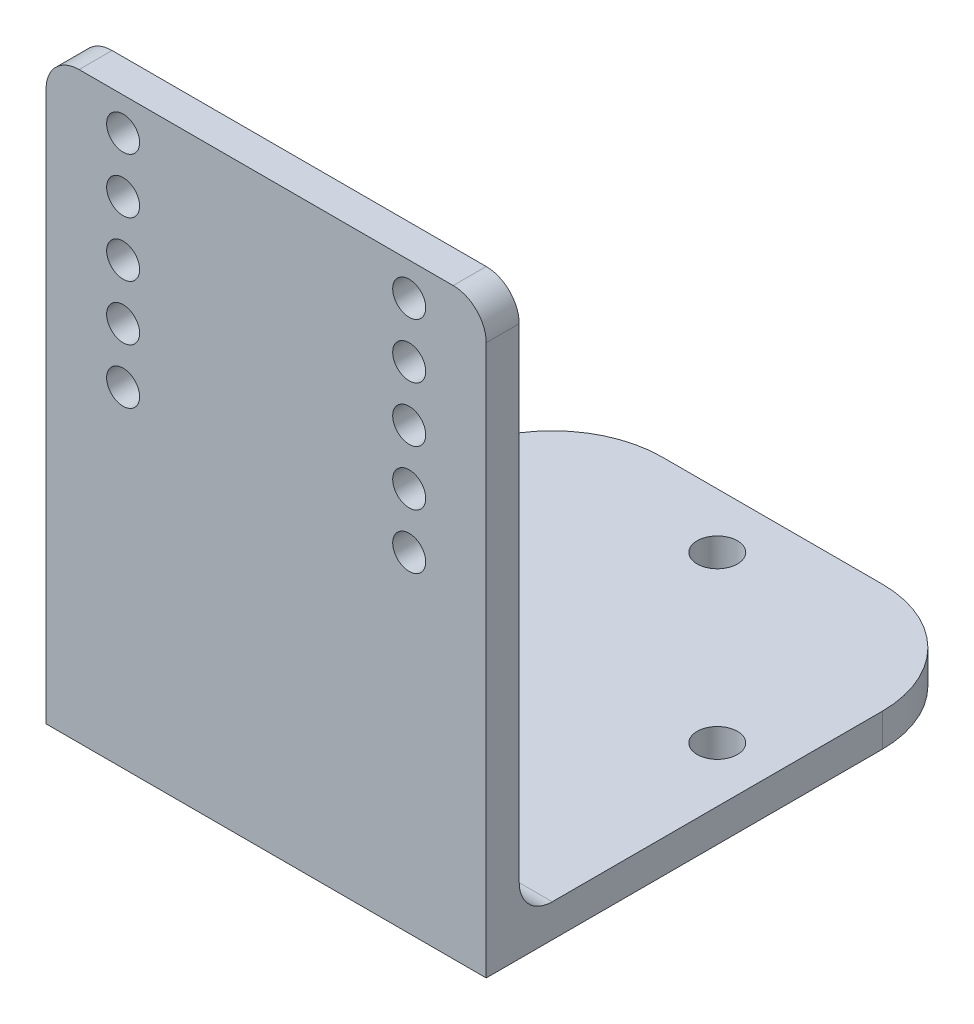
ISO-10303-21;
HEADER;
FILE_DESCRIPTION(('STEP AP214'),'2;1');
FILE_NAME('part.step','',(''),(''),'','','');
FILE_SCHEMA(('AUTOMOTIVE_DESIGN { 1 0 10303 214 1 1 1 1 }'));
ENDSEC;
DATA;
#1=APPLICATION_CONTEXT('core data for automotive mechanical design processes');
#2=APPLICATION_PROTOCOL_DEFINITION('international standard','automotive_design',2000,#1);
#3=PRODUCT_CONTEXT('',#1,'mechanical');
#4=PRODUCT('Part','Part','',(#3));
#5=PRODUCT_RELATED_PRODUCT_CATEGORY('part','',(#4));
#6=PRODUCT_DEFINITION_FORMATION('','',#4);
#7=PRODUCT_DEFINITION_CONTEXT('part definition',#1,'design');
#8=PRODUCT_DEFINITION('design','',#6,#7);
#9=PRODUCT_DEFINITION_SHAPE('','',#8);
#10=(LENGTH_UNIT() NAMED_UNIT(*) SI_UNIT(.MILLI.,.METRE.));
#11=(NAMED_UNIT(*) PLANE_ANGLE_UNIT() SI_UNIT($,.RADIAN.));
#12=(NAMED_UNIT(*) SI_UNIT($,.STERADIAN.) SOLID_ANGLE_UNIT());
#13=UNCERTAINTY_MEASURE_WITH_UNIT(LENGTH_MEASURE(1.E-05),#10,'distance_accuracy_value','');
#14=(GEOMETRIC_REPRESENTATION_CONTEXT(3) GLOBAL_UNCERTAINTY_ASSIGNED_CONTEXT((#13)) GLOBAL_UNIT_ASSIGNED_CONTEXT((#10,
#11,#12)) REPRESENTATION_CONTEXT('',''));
#15=CARTESIAN_POINT('',(0.,0.,0.));
#16=DIRECTION('',(0.,0.,1.));
#17=DIRECTION('',(1.,0.,0.));
#18=AXIS2_PLACEMENT_3D('',#15,#16,#17);
#19=CARTESIAN_POINT('',(0.,3.,0.));
#20=DIRECTION('',(0.,-1.,0.));
#21=DIRECTION('',(0.,0.,-1.));
#22=AXIS2_PLACEMENT_3D('',#19,#20,#21);
#23=PLANE('',#22);
#24=DIRECTION('',(-1.,0.,0.));
#25=VECTOR('',#24,1.);
#26=CARTESIAN_POINT('',(-20.,3.,-20.));
#27=LINE('',#26,#25);
#28=CARTESIAN_POINT('',(9.99999999999999,3.,-20.));
#29=VERTEX_POINT('',#28);
#30=CARTESIAN_POINT('',(-10.,3.,-20.));
#31=VERTEX_POINT('',#30);
#32=EDGE_CURVE('E262',#29,#31,#27,.T.);
#33=ORIENTED_EDGE('',*,*,#32,.T.);
#34=CARTESIAN_POINT('',(-10.,3.,-9.99999999999999));
#35=DIRECTION('',(0.,-1.,0.));
#36=DIRECTION('',(0.,0.,-1.));
#37=AXIS2_PLACEMENT_3D('',#34,#35,#36);
#38=CIRCLE('',#37,10.);
#39=CARTESIAN_POINT('',(-20.,3.,-9.99999999999999));
#40=VERTEX_POINT('',#39);
#41=EDGE_CURVE('E54',#31,#40,#38,.F.);
#42=ORIENTED_EDGE('',*,*,#41,.T.);
#43=DIRECTION('',(0.,0.,1.));
#44=VECTOR('',#43,1.);
#45=CARTESIAN_POINT('',(-20.,3.,23.));
#46=LINE('',#45,#44);
#47=CARTESIAN_POINT('',(-20.,3.,20.));
#48=VERTEX_POINT('',#47);
#49=EDGE_CURVE('E255',#40,#48,#46,.T.);
#50=ORIENTED_EDGE('',*,*,#49,.T.);
#51=DIRECTION('',(1.,0.,0.));
#52=VECTOR('',#51,1.);
#53=CARTESIAN_POINT('',(0.,3.,20.));
#54=LINE('',#53,#52);
#55=CARTESIAN_POINT('',(-10.,3.,20.));
#56=VERTEX_POINT('',#55);
#57=EDGE_CURVE('E321',#48,#56,#54,.T.);
#58=ORIENTED_EDGE('',*,*,#57,.T.);
#59=DIRECTION('',(0.,0.,1.));
#60=VECTOR('',#59,1.);
#61=CARTESIAN_POINT('',(-10.,3.,23.));
#62=LINE('',#61,#60);
#63=CARTESIAN_POINT('',(-10.,3.,16.));
#64=VERTEX_POINT('',#63);
#65=EDGE_CURVE('E378',#64,#56,#62,.T.);
#66=ORIENTED_EDGE('',*,*,#65,.F.);
#67=CARTESIAN_POINT('',(-7.,3.,16.));
#68=DIRECTION('',(0.,-1.,0.));
#69=DIRECTION('',(0.,0.,-1.));
#70=AXIS2_PLACEMENT_3D('',#67,#68,#69);
#71=CIRCLE('',#70,3.);
#72=CARTESIAN_POINT('',(-7.,3.,13.));
#73=VERTEX_POINT('',#72);
#74=EDGE_CURVE('E362',#64,#73,#71,.T.);
#75=ORIENTED_EDGE('',*,*,#74,.T.);
#76=DIRECTION('',(-1.,0.,0.));
#77=VECTOR('',#76,1.);
#78=CARTESIAN_POINT('',(-10.,3.,13.));
#79=LINE('',#78,#77);
#80=CARTESIAN_POINT('',(7.,3.,13.));
#81=VERTEX_POINT('',#80);
#82=EDGE_CURVE('E444',#81,#73,#79,.T.);
#83=ORIENTED_EDGE('',*,*,#82,.F.);
#84=CARTESIAN_POINT('',(7.,3.,16.));
#85=DIRECTION('',(0.,-1.,0.));
#86=DIRECTION('',(0.,0.,-1.));
#87=AXIS2_PLACEMENT_3D('',#84,#85,#86);
#88=CIRCLE('',#87,3.);
#89=CARTESIAN_POINT('',(10.,3.,16.));
#90=VERTEX_POINT('',#89);
#91=EDGE_CURVE('E368',#81,#90,#88,.T.);
#92=ORIENTED_EDGE('',*,*,#91,.T.);
#93=DIRECTION('',(0.,0.,-1.));
#94=VECTOR('',#93,1.);
#95=CARTESIAN_POINT('',(10.,3.,23.));
#96=LINE('',#95,#94);
#97=CARTESIAN_POINT('',(10.,3.,20.));
#98=VERTEX_POINT('',#97);
#99=EDGE_CURVE('E440',#98,#90,#96,.T.);
#100=ORIENTED_EDGE('',*,*,#99,.F.);
#101=DIRECTION('',(1.,0.,0.));
#102=VECTOR('',#101,1.);
#103=CARTESIAN_POINT('',(0.,3.,20.));
#104=LINE('',#103,#102);
#105=CARTESIAN_POINT('',(20.,3.,20.));
#106=VERTEX_POINT('',#105);
#107=EDGE_CURVE('E325',#98,#106,#104,.T.);
#108=ORIENTED_EDGE('',*,*,#107,.T.);
#109=DIRECTION('',(0.,0.,-1.));
#110=VECTOR('',#109,1.);
#111=CARTESIAN_POINT('',(20.,3.,23.));
#112=LINE('',#111,#110);
#113=CARTESIAN_POINT('',(20.,3.,-9.99999999999999));
#114=VERTEX_POINT('',#113);
#115=EDGE_CURVE('E258',#106,#114,#112,.T.);
#116=ORIENTED_EDGE('',*,*,#115,.T.);
#117=CARTESIAN_POINT('',(9.99999999999999,3.,-10.));
#118=DIRECTION('',(0.,-1.,0.));
#119=DIRECTION('',(0.,0.,-1.));
#120=AXIS2_PLACEMENT_3D('',#117,#118,#119);
#121=CIRCLE('',#120,10.);
#122=EDGE_CURVE('E396',#114,#29,#121,.F.);
#123=ORIENTED_EDGE('',*,*,#122,.T.);
#124=EDGE_LOOP('',(#33,#42,#50,#58,#66,#75,#83,#92,#100,#108,#116,#123));
#125=FACE_BOUND('',#124,.T.);
#126=CARTESIAN_POINT('',(0.,3.,-15.));
#127=DIRECTION('',(0.,1.,0.));
#128=DIRECTION('',(0.,0.,1.));
#129=AXIS2_PLACEMENT_3D('',#126,#127,#128);
#130=CIRCLE('',#129,1.83079673218972);
#131=CARTESIAN_POINT('',(0.,3.,-13.1692032678103));
#132=VERTEX_POINT('',#131);
#133=EDGE_CURVE('E193',#132,#132,#130,.T.);
#134=ORIENTED_EDGE('',*,*,#133,.F.);
#135=EDGE_LOOP('',(#134));
#136=FACE_BOUND('',#135,.T.);
#137=CARTESIAN_POINT('',(-15.,3.,0.));
#138=DIRECTION('',(0.,1.,0.));
#139=DIRECTION('',(0.,0.,1.));
#140=AXIS2_PLACEMENT_3D('',#137,#138,#139);
#141=CIRCLE('',#140,1.83079673218972);
#142=CARTESIAN_POINT('',(-15.,3.,1.83079673218972));
#143=VERTEX_POINT('',#142);
#144=EDGE_CURVE('E241',#143,#143,#141,.T.);
#145=ORIENTED_EDGE('',*,*,#144,.F.);
#146=EDGE_LOOP('',(#145));
#147=FACE_BOUND('',#146,.T.);
#148=CARTESIAN_POINT('',(15.,3.,0.));
#149=DIRECTION('',(0.,1.,0.));
#150=DIRECTION('',(0.,0.,-1.));
#151=AXIS2_PLACEMENT_3D('',#148,#149,#150);
#152=CIRCLE('',#151,1.83079673218972);
#153=CARTESIAN_POINT('',(15.,3.,-1.83079673218972));
#154=VERTEX_POINT('',#153);
#155=EDGE_CURVE('E233',#154,#154,#152,.T.);
#156=ORIENTED_EDGE('',*,*,#155,.F.);
#157=EDGE_LOOP('',(#156));
#158=FACE_BOUND('',#157,.T.);
#159=ADVANCED_FACE('F45',(#125,#136,#147,#158),#23,.F.);
#160=CARTESIAN_POINT('',(0.,0.,0.));
#161=DIRECTION('',(0.,-1.,0.));
#162=DIRECTION('',(0.,0.,-1.));
#163=AXIS2_PLACEMENT_3D('',#160,#161,#162);
#164=PLANE('',#163);
#165=DIRECTION('',(0.,0.,-1.));
#166=VECTOR('',#165,1.);
#167=CARTESIAN_POINT('',(-10.,0.,0.));
#168=LINE('',#167,#166);
#169=CARTESIAN_POINT('',(-10.,0.,20.));
#170=VERTEX_POINT('',#169);
#171=CARTESIAN_POINT('',(-10.,0.,16.));
#172=VERTEX_POINT('',#171);
#173=EDGE_CURVE('E281',#170,#172,#168,.T.);
#174=ORIENTED_EDGE('',*,*,#173,.F.);
#175=CARTESIAN_POINT('',(-7.,0.,20.));
#176=DIRECTION('',(0.,-1.,0.));
#177=DIRECTION('',(0.,0.,-1.));
#178=AXIS2_PLACEMENT_3D('',#175,#176,#177);
#179=CIRCLE('',#178,3.);
#180=CARTESIAN_POINT('',(-7.,0.,23.));
#181=VERTEX_POINT('',#180);
#182=EDGE_CURVE('E359',#170,#181,#179,.F.);
#183=ORIENTED_EDGE('',*,*,#182,.T.);
#184=DIRECTION('',(-1.,0.,0.));
#185=VECTOR('',#184,1.);
#186=CARTESIAN_POINT('',(0.,0.,23.));
#187=LINE('',#186,#185);
#188=CARTESIAN_POINT('',(7.,0.,23.));
#189=VERTEX_POINT('',#188);
#190=EDGE_CURVE('E264',#189,#181,#187,.T.);
#191=ORIENTED_EDGE('',*,*,#190,.F.);
#192=CARTESIAN_POINT('',(7.,0.,20.));
#193=DIRECTION('',(0.,-1.,0.));
#194=DIRECTION('',(0.,0.,-1.));
#195=AXIS2_PLACEMENT_3D('',#192,#193,#194);
#196=CIRCLE('',#195,3.);
#197=CARTESIAN_POINT('',(10.,0.,20.));
#198=VERTEX_POINT('',#197);
#199=EDGE_CURVE('E356',#189,#198,#196,.F.);
#200=ORIENTED_EDGE('',*,*,#199,.T.);
#201=DIRECTION('',(0.,0.,1.));
#202=VECTOR('',#201,1.);
#203=CARTESIAN_POINT('',(9.99999999999999,0.,0.));
#204=LINE('',#203,#202);
#205=CARTESIAN_POINT('',(10.,0.,16.));
#206=VERTEX_POINT('',#205);
#207=EDGE_CURVE('E273',#206,#198,#204,.T.);
#208=ORIENTED_EDGE('',*,*,#207,.F.);
#209=CARTESIAN_POINT('',(7.,0.,16.));
#210=DIRECTION('',(0.,-1.,0.));
#211=DIRECTION('',(0.,0.,-1.));
#212=AXIS2_PLACEMENT_3D('',#209,#210,#211);
#213=CIRCLE('',#212,3.);
#214=CARTESIAN_POINT('',(7.,0.,13.));
#215=VERTEX_POINT('',#214);
#216=EDGE_CURVE('E371',#206,#215,#213,.F.);
#217=ORIENTED_EDGE('',*,*,#216,.T.);
#218=DIRECTION('',(1.,0.,0.));
#219=VECTOR('',#218,1.);
#220=CARTESIAN_POINT('',(0.,0.,13.));
#221=LINE('',#220,#219);
#222=CARTESIAN_POINT('',(-7.,0.,13.));
#223=VERTEX_POINT('',#222);
#224=EDGE_CURVE('E277',#223,#215,#221,.T.);
#225=ORIENTED_EDGE('',*,*,#224,.F.);
#226=CARTESIAN_POINT('',(-7.,0.,16.));
#227=DIRECTION('',(0.,-1.,0.));
#228=DIRECTION('',(0.,0.,-1.));
#229=AXIS2_PLACEMENT_3D('',#226,#227,#228);
#230=CIRCLE('',#229,3.);
#231=EDGE_CURVE('E365',#223,#172,#230,.F.);
#232=ORIENTED_EDGE('',*,*,#231,.T.);
#233=EDGE_LOOP('',(#174,#183,#191,#200,#208,#217,#225,#232));
#234=FACE_BOUND('',#233,.T.);
#235=CARTESIAN_POINT('',(0.,0.,-15.));
#236=DIRECTION('',(0.,1.,0.));
#237=DIRECTION('',(0.,0.,1.));
#238=AXIS2_PLACEMENT_3D('',#235,#236,#237);
#239=CIRCLE('',#238,1.83079673218972);
#240=CARTESIAN_POINT('',(0.,0.,-13.1692032678103));
#241=VERTEX_POINT('',#240);
#242=EDGE_CURVE('E245',#241,#241,#239,.T.);
#243=ORIENTED_EDGE('',*,*,#242,.T.);
#244=EDGE_LOOP('',(#243));
#245=FACE_BOUND('',#244,.T.);
#246=DIRECTION('',(0.,0.,1.));
#247=VECTOR('',#246,1.);
#248=CARTESIAN_POINT('',(-20.,0.,23.));
#249=LINE('',#248,#247);
#250=CARTESIAN_POINT('',(-20.,0.,-9.99999999999999));
#251=VERTEX_POINT('',#250);
#252=CARTESIAN_POINT('',(-20.,0.,26.));
#253=VERTEX_POINT('',#252);
#254=EDGE_CURVE('E180',#251,#253,#249,.T.);
#255=ORIENTED_EDGE('',*,*,#254,.F.);
#256=CARTESIAN_POINT('',(-10.,0.,-9.99999999999999));
#257=DIRECTION('',(0.,-1.,0.));
#258=DIRECTION('',(0.,0.,-1.));
#259=AXIS2_PLACEMENT_3D('',#256,#257,#258);
#260=CIRCLE('',#259,10.);
#261=CARTESIAN_POINT('',(-10.,0.,-20.));
#262=VERTEX_POINT('',#261);
#263=EDGE_CURVE('E387',#251,#262,#260,.T.);
#264=ORIENTED_EDGE('',*,*,#263,.T.);
#265=DIRECTION('',(-1.,0.,0.));
#266=VECTOR('',#265,1.);
#267=CARTESIAN_POINT('',(-20.,0.,-20.));
#268=LINE('',#267,#266);
#269=CARTESIAN_POINT('',(9.99999999999999,0.,-20.));
#270=VERTEX_POINT('',#269);
#271=EDGE_CURVE('E259',#270,#262,#268,.T.);
#272=ORIENTED_EDGE('',*,*,#271,.F.);
#273=CARTESIAN_POINT('',(9.99999999999999,0.,-10.));
#274=DIRECTION('',(0.,-1.,0.));
#275=DIRECTION('',(0.,0.,-1.));
#276=AXIS2_PLACEMENT_3D('',#273,#274,#275);
#277=CIRCLE('',#276,10.);
#278=CARTESIAN_POINT('',(20.,0.,-9.99999999999999));
#279=VERTEX_POINT('',#278);
#280=EDGE_CURVE('E384',#270,#279,#277,.T.);
#281=ORIENTED_EDGE('',*,*,#280,.T.);
#282=DIRECTION('',(0.,0.,-1.));
#283=VECTOR('',#282,1.);
#284=CARTESIAN_POINT('',(20.,0.,23.));
#285=LINE('',#284,#283);
#286=CARTESIAN_POINT('',(20.,0.,26.));
#287=VERTEX_POINT('',#286);
#288=EDGE_CURVE('E192',#287,#279,#285,.T.);
#289=ORIENTED_EDGE('',*,*,#288,.F.);
#290=DIRECTION('',(1.,0.,0.));
#291=VECTOR('',#290,1.);
#292=CARTESIAN_POINT('',(-20.,0.,26.));
#293=LINE('',#292,#291);
#294=EDGE_CURVE('E200',#253,#287,#293,.T.);
#295=ORIENTED_EDGE('',*,*,#294,.F.);
#296=EDGE_LOOP('',(#255,#264,#272,#281,#289,#295));
#297=FACE_BOUND('',#296,.T.);
#298=CARTESIAN_POINT('',(-15.,0.,0.));
#299=DIRECTION('',(0.,1.,0.));
#300=DIRECTION('',(0.,0.,1.));
#301=AXIS2_PLACEMENT_3D('',#298,#299,#300);
#302=CIRCLE('',#301,1.83079673218972);
#303=CARTESIAN_POINT('',(-15.,0.,1.83079673218972));
#304=VERTEX_POINT('',#303);
#305=EDGE_CURVE('E237',#304,#304,#302,.T.);
#306=ORIENTED_EDGE('',*,*,#305,.T.);
#307=EDGE_LOOP('',(#306));
#308=FACE_BOUND('',#307,.T.);
#309=CARTESIAN_POINT('',(15.,0.,0.));
#310=DIRECTION('',(0.,1.,0.));
#311=DIRECTION('',(0.,0.,-1.));
#312=AXIS2_PLACEMENT_3D('',#309,#310,#311);
#313=CIRCLE('',#312,1.83079673218972);
#314=CARTESIAN_POINT('',(15.,0.,-1.83079673218972));
#315=VERTEX_POINT('',#314);
#316=EDGE_CURVE('E220',#315,#315,#313,.T.);
#317=ORIENTED_EDGE('',*,*,#316,.T.);
#318=EDGE_LOOP('',(#317));
#319=FACE_BOUND('',#318,.T.);
#320=ADVANCED_FACE('F208',(#234,#245,#297,#308,#319),#164,.T.);
#321=CARTESIAN_POINT('',(-20.,3.,23.));
#322=DIRECTION('',(1.,0.,0.));
#323=DIRECTION('',(0.,0.,-1.));
#324=AXIS2_PLACEMENT_3D('',#321,#322,#323);
#325=PLANE('',#324);
#326=ORIENTED_EDGE('',*,*,#49,.F.);
#327=DIRECTION('',(0.,-1.,0.));
#328=VECTOR('',#327,1.);
#329=CARTESIAN_POINT('',(-20.,3.,-9.99999999999999));
#330=LINE('',#329,#328);
#331=EDGE_CURVE('E188',#40,#251,#330,.T.);
#332=ORIENTED_EDGE('',*,*,#331,.T.);
#333=ORIENTED_EDGE('',*,*,#254,.T.);
#334=DIRECTION('',(0.,-1.,0.));
#335=VECTOR('',#334,1.);
#336=CARTESIAN_POINT('',(-20.,0.,26.));
#337=LINE('',#336,#335);
#338=CARTESIAN_POINT('',(-20.,50.,26.));
#339=VERTEX_POINT('',#338);
#340=EDGE_CURVE('E185',#339,#253,#337,.T.);
#341=ORIENTED_EDGE('',*,*,#340,.F.);
#342=DIRECTION('',(0.,0.,-1.));
#343=VECTOR('',#342,1.);
#344=CARTESIAN_POINT('',(-20.,50.,23.));
#345=LINE('',#344,#343);
#346=CARTESIAN_POINT('',(-20.,50.,23.));
#347=VERTEX_POINT('',#346);
#348=EDGE_CURVE('E318',#339,#347,#345,.T.);
#349=ORIENTED_EDGE('',*,*,#348,.T.);
#350=DIRECTION('',(0.,-1.,0.));
#351=VECTOR('',#350,1.);
#352=CARTESIAN_POINT('',(-20.,3.,23.));
#353=LINE('',#352,#351);
#354=CARTESIAN_POINT('',(-20.,6.,23.));
#355=VERTEX_POINT('',#354);
#356=EDGE_CURVE('E206',#347,#355,#353,.T.);
#357=ORIENTED_EDGE('',*,*,#356,.T.);
#358=CARTESIAN_POINT('',(-20.,6.,20.));
#359=DIRECTION('',(1.,0.,0.));
#360=DIRECTION('',(0.,0.,-1.));
#361=AXIS2_PLACEMENT_3D('',#358,#359,#360);
#362=CIRCLE('',#361,3.);
#363=EDGE_CURVE('E352',#355,#48,#362,.T.);
#364=ORIENTED_EDGE('',*,*,#363,.T.);
#365=EDGE_LOOP('',(#326,#332,#333,#341,#349,#357,#364));
#366=FACE_BOUND('',#365,.T.);
#367=ADVANCED_FACE('F183',(#366),#325,.F.);
#368=CARTESIAN_POINT('',(20.,3.,23.));
#369=DIRECTION('',(-1.,0.,0.));
#370=DIRECTION('',(0.,0.,1.));
#371=AXIS2_PLACEMENT_3D('',#368,#369,#370);
#372=PLANE('',#371);
#373=ORIENTED_EDGE('',*,*,#288,.T.);
#374=DIRECTION('',(0.,-1.,0.));
#375=VECTOR('',#374,1.);
#376=CARTESIAN_POINT('',(20.,3.,-9.99999999999999));
#377=LINE('',#376,#375);
#378=EDGE_CURVE('E11',#279,#114,#377,.F.);
#379=ORIENTED_EDGE('',*,*,#378,.T.);
#380=ORIENTED_EDGE('',*,*,#115,.F.);
#381=CARTESIAN_POINT('',(20.,6.,20.));
#382=DIRECTION('',(-1.,0.,0.));
#383=DIRECTION('',(0.,0.,1.));
#384=AXIS2_PLACEMENT_3D('',#381,#382,#383);
#385=CIRCLE('',#384,3.);
#386=CARTESIAN_POINT('',(20.,6.00000000000001,23.));
#387=VERTEX_POINT('',#386);
#388=EDGE_CURVE('E349',#106,#387,#385,.T.);
#389=ORIENTED_EDGE('',*,*,#388,.T.);
#390=DIRECTION('',(0.,1.,0.));
#391=VECTOR('',#390,1.);
#392=CARTESIAN_POINT('',(20.,23.,23.));
#393=LINE('',#392,#391);
#394=CARTESIAN_POINT('',(20.,50.,23.));
#395=VERTEX_POINT('',#394);
#396=EDGE_CURVE('E221',#387,#395,#393,.T.);
#397=ORIENTED_EDGE('',*,*,#396,.T.);
#398=DIRECTION('',(0.,0.,-1.));
#399=VECTOR('',#398,1.);
#400=CARTESIAN_POINT('',(20.,50.,23.));
#401=LINE('',#400,#399);
#402=CARTESIAN_POINT('',(20.,50.,26.));
#403=VERTEX_POINT('',#402);
#404=EDGE_CURVE('E310',#395,#403,#401,.F.);
#405=ORIENTED_EDGE('',*,*,#404,.T.);
#406=DIRECTION('',(0.,1.,0.));
#407=VECTOR('',#406,1.);
#408=CARTESIAN_POINT('',(20.,0.,26.));
#409=LINE('',#408,#407);
#410=EDGE_CURVE('E211',#287,#403,#409,.T.);
#411=ORIENTED_EDGE('',*,*,#410,.F.);
#412=EDGE_LOOP('',(#373,#379,#380,#389,#397,#405,#411));
#413=FACE_BOUND('',#412,.T.);
#414=ADVANCED_FACE('F411',(#413),#372,.F.);
#415=CARTESIAN_POINT('',(-20.,3.,-20.));
#416=DIRECTION('',(0.,0.,1.));
#417=DIRECTION('',(1.,0.,0.));
#418=AXIS2_PLACEMENT_3D('',#415,#416,#417);
#419=PLANE('',#418);
#420=ORIENTED_EDGE('',*,*,#271,.T.);
#421=DIRECTION('',(0.,-1.,0.));
#422=VECTOR('',#421,1.);
#423=CARTESIAN_POINT('',(-10.,3.,-20.));
#424=LINE('',#423,#422);
#425=EDGE_CURVE('E67',#262,#31,#424,.F.);
#426=ORIENTED_EDGE('',*,*,#425,.T.);
#427=ORIENTED_EDGE('',*,*,#32,.F.);
#428=DIRECTION('',(0.,-1.,0.));
#429=VECTOR('',#428,1.);
#430=CARTESIAN_POINT('',(9.99999999999999,3.,-20.));
#431=LINE('',#430,#429);
#432=EDGE_CURVE('E390',#29,#270,#431,.T.);
#433=ORIENTED_EDGE('',*,*,#432,.T.);
#434=EDGE_LOOP('',(#420,#426,#427,#433));
#435=FACE_BOUND('',#434,.T.);
#436=ADVANCED_FACE('F407',(#435),#419,.F.);
#437=CARTESIAN_POINT('',(0.,3.,-15.));
#438=DIRECTION('',(0.,-1.,0.));
#439=DIRECTION('',(0.,0.,-1.));
#440=AXIS2_PLACEMENT_3D('',#437,#438,#439);
#441=CYLINDRICAL_SURFACE('',#440,1.83079673218972);
#442=ORIENTED_EDGE('',*,*,#133,.T.);
#443=EDGE_LOOP('',(#442));
#444=FACE_BOUND('',#443,.T.);
#445=ORIENTED_EDGE('',*,*,#242,.F.);
#446=EDGE_LOOP('',(#445));
#447=FACE_BOUND('',#446,.T.);
#448=ADVANCED_FACE('F555',(#444,#447),#441,.F.);
#449=CARTESIAN_POINT('',(-15.,3.,0.));
#450=DIRECTION('',(0.,-1.,0.));
#451=DIRECTION('',(0.,0.,-1.));
#452=AXIS2_PLACEMENT_3D('',#449,#450,#451);
#453=CYLINDRICAL_SURFACE('',#452,1.83079673218972);
#454=ORIENTED_EDGE('',*,*,#144,.T.);
#455=EDGE_LOOP('',(#454));
#456=FACE_BOUND('',#455,.T.);
#457=ORIENTED_EDGE('',*,*,#305,.F.);
#458=EDGE_LOOP('',(#457));
#459=FACE_BOUND('',#458,.T.);
#460=ADVANCED_FACE('F798',(#456,#459),#453,.F.);
#461=CARTESIAN_POINT('',(15.,3.,0.));
#462=DIRECTION('',(0.,-1.,0.));
#463=DIRECTION('',(0.,0.,-1.));
#464=AXIS2_PLACEMENT_3D('',#461,#462,#463);
#465=CYLINDRICAL_SURFACE('',#464,1.83079673218972);
#466=ORIENTED_EDGE('',*,*,#155,.T.);
#467=EDGE_LOOP('',(#466));
#468=FACE_BOUND('',#467,.T.);
#469=ORIENTED_EDGE('',*,*,#316,.F.);
#470=EDGE_LOOP('',(#469));
#471=FACE_BOUND('',#470,.T.);
#472=ADVANCED_FACE('F686',(#468,#471),#465,.F.);
#473=CARTESIAN_POINT('',(0.,0.,23.));
#474=DIRECTION('',(0.,0.,-1.));
#475=DIRECTION('',(-1.,0.,0.));
#476=AXIS2_PLACEMENT_3D('',#473,#474,#475);
#477=PLANE('',#476);
#478=CARTESIAN_POINT('',(13.,50.,23.));
#479=DIRECTION('',(0.,0.,1.));
#480=DIRECTION('',(-1.,0.,0.));
#481=AXIS2_PLACEMENT_3D('',#478,#479,#480);
#482=CIRCLE('',#481,1.5);
#483=CARTESIAN_POINT('',(11.5,50.,23.));
#484=VERTEX_POINT('',#483);
#485=EDGE_CURVE('E450',#484,#484,#482,.T.);
#486=ORIENTED_EDGE('',*,*,#485,.T.);
#487=EDGE_LOOP('',(#486));
#488=FACE_BOUND('',#487,.T.);
#489=CARTESIAN_POINT('',(12.9999999999999,40.,23.));
#490=DIRECTION('',(0.,0.,1.));
#491=DIRECTION('',(-1.,0.,0.));
#492=AXIS2_PLACEMENT_3D('',#489,#490,#491);
#493=CIRCLE('',#492,1.5);
#494=CARTESIAN_POINT('',(11.4999999999999,40.,23.));
#495=VERTEX_POINT('',#494);
#496=EDGE_CURVE('E463',#495,#495,#493,.T.);
#497=ORIENTED_EDGE('',*,*,#496,.T.);
#498=EDGE_LOOP('',(#497));
#499=FACE_BOUND('',#498,.T.);
#500=CARTESIAN_POINT('',(12.9999999999998,30.,23.));
#501=DIRECTION('',(0.,0.,1.));
#502=DIRECTION('',(-1.,0.,0.));
#503=AXIS2_PLACEMENT_3D('',#500,#501,#502);
#504=CIRCLE('',#503,1.5);
#505=CARTESIAN_POINT('',(11.4999999999998,30.,23.));
#506=VERTEX_POINT('',#505);
#507=EDGE_CURVE('E479',#506,#506,#504,.T.);
#508=ORIENTED_EDGE('',*,*,#507,.T.);
#509=EDGE_LOOP('',(#508));
#510=FACE_BOUND('',#509,.T.);
#511=CARTESIAN_POINT('',(-12.9999999999998,35.,23.));
#512=DIRECTION('',(0.,0.,1.));
#513=DIRECTION('',(1.,0.,0.));
#514=AXIS2_PLACEMENT_3D('',#511,#512,#513);
#515=CIRCLE('',#514,1.5);
#516=CARTESIAN_POINT('',(-11.4999999999998,35.,23.));
#517=VERTEX_POINT('',#516);
#518=EDGE_CURVE('E495',#517,#517,#515,.T.);
#519=ORIENTED_EDGE('',*,*,#518,.T.);
#520=EDGE_LOOP('',(#519));
#521=FACE_BOUND('',#520,.T.);
#522=CARTESIAN_POINT('',(-13.,45.,23.));
#523=DIRECTION('',(0.,0.,1.));
#524=DIRECTION('',(1.,0.,0.));
#525=AXIS2_PLACEMENT_3D('',#522,#523,#524);
#526=CIRCLE('',#525,1.5);
#527=CARTESIAN_POINT('',(-11.4999999999999,45.,23.));
#528=VERTEX_POINT('',#527);
#529=EDGE_CURVE('E511',#528,#528,#526,.T.);
#530=ORIENTED_EDGE('',*,*,#529,.T.);
#531=EDGE_LOOP('',(#530));
#532=FACE_BOUND('',#531,.T.);
#533=CARTESIAN_POINT('',(-13.,50.,23.));
#534=DIRECTION('',(0.,0.,1.));
#535=DIRECTION('',(1.,0.,0.));
#536=AXIS2_PLACEMENT_3D('',#533,#534,#535);
#537=CIRCLE('',#536,1.5);
#538=CARTESIAN_POINT('',(-11.5,50.,23.));
#539=VERTEX_POINT('',#538);
#540=EDGE_CURVE('E519',#539,#539,#537,.T.);
#541=ORIENTED_EDGE('',*,*,#540,.T.);
#542=EDGE_LOOP('',(#541));
#543=FACE_BOUND('',#542,.T.);
#544=CARTESIAN_POINT('',(-12.9999999999999,40.,23.));
#545=DIRECTION('',(0.,0.,1.));
#546=DIRECTION('',(1.,0.,0.));
#547=AXIS2_PLACEMENT_3D('',#544,#545,#546);
#548=CIRCLE('',#547,1.5);
#549=CARTESIAN_POINT('',(-11.4999999999999,40.,23.));
#550=VERTEX_POINT('',#549);
#551=EDGE_CURVE('E503',#550,#550,#548,.T.);
#552=ORIENTED_EDGE('',*,*,#551,.T.);
#553=EDGE_LOOP('',(#552));
#554=FACE_BOUND('',#553,.T.);
#555=CARTESIAN_POINT('',(-12.9999999999998,30.,23.));
#556=DIRECTION('',(0.,0.,1.));
#557=DIRECTION('',(1.,0.,0.));
#558=AXIS2_PLACEMENT_3D('',#555,#556,#557);
#559=CIRCLE('',#558,1.5);
#560=CARTESIAN_POINT('',(-11.4999999999998,30.,23.));
#561=VERTEX_POINT('',#560);
#562=EDGE_CURVE('E487',#561,#561,#559,.T.);
#563=ORIENTED_EDGE('',*,*,#562,.T.);
#564=EDGE_LOOP('',(#563));
#565=FACE_BOUND('',#564,.T.);
#566=CARTESIAN_POINT('',(12.9999999999998,35.,23.));
#567=DIRECTION('',(0.,0.,1.));
#568=DIRECTION('',(-1.,0.,0.));
#569=AXIS2_PLACEMENT_3D('',#566,#567,#568);
#570=CIRCLE('',#569,1.5);
#571=CARTESIAN_POINT('',(11.4999999999998,35.,23.));
#572=VERTEX_POINT('',#571);
#573=EDGE_CURVE('E471',#572,#572,#570,.T.);
#574=ORIENTED_EDGE('',*,*,#573,.T.);
#575=EDGE_LOOP('',(#574));
#576=FACE_BOUND('',#575,.T.);
#577=CARTESIAN_POINT('',(12.9999999999999,45.,23.));
#578=DIRECTION('',(0.,0.,1.));
#579=DIRECTION('',(-1.,0.,0.));
#580=AXIS2_PLACEMENT_3D('',#577,#578,#579);
#581=CIRCLE('',#580,1.5);
#582=CARTESIAN_POINT('',(11.4999999999999,45.,23.));
#583=VERTEX_POINT('',#582);
#584=EDGE_CURVE('E455',#583,#583,#581,.T.);
#585=ORIENTED_EDGE('',*,*,#584,.T.);
#586=EDGE_LOOP('',(#585));
#587=FACE_BOUND('',#586,.T.);
#588=DIRECTION('',(-1.,0.,0.));
#589=VECTOR('',#588,1.);
#590=CARTESIAN_POINT('',(-20.,53.,23.));
#591=LINE('',#590,#589);
#592=CARTESIAN_POINT('',(17.,53.,23.));
#593=VERTEX_POINT('',#592);
#594=CARTESIAN_POINT('',(-17.,53.,23.));
#595=VERTEX_POINT('',#594);
#596=EDGE_CURVE('E225',#593,#595,#591,.T.);
#597=ORIENTED_EDGE('',*,*,#596,.F.);
#598=CARTESIAN_POINT('',(17.,50.,23.));
#599=DIRECTION('',(0.,0.,-1.));
#600=DIRECTION('',(-1.,0.,0.));
#601=AXIS2_PLACEMENT_3D('',#598,#599,#600);
#602=CIRCLE('',#601,3.);
#603=EDGE_CURVE('E307',#593,#395,#602,.T.);
#604=ORIENTED_EDGE('',*,*,#603,.T.);
#605=ORIENTED_EDGE('',*,*,#396,.F.);
#606=DIRECTION('',(1.,0.,0.));
#607=VECTOR('',#606,1.);
#608=CARTESIAN_POINT('',(0.,6.,23.));
#609=LINE('',#608,#607);
#610=CARTESIAN_POINT('',(7.,6.,23.));
#611=VERTEX_POINT('',#610);
#612=EDGE_CURVE('E301',#387,#611,#609,.F.);
#613=ORIENTED_EDGE('',*,*,#612,.T.);
#614=DIRECTION('',(0.,1.,0.));
#615=VECTOR('',#614,1.);
#616=CARTESIAN_POINT('',(7.,0.,23.));
#617=LINE('',#616,#615);
#618=EDGE_CURVE('E298',#611,#189,#617,.F.);
#619=ORIENTED_EDGE('',*,*,#618,.T.);
#620=ORIENTED_EDGE('',*,*,#190,.T.);
#621=DIRECTION('',(0.,1.,0.));
#622=VECTOR('',#621,1.);
#623=CARTESIAN_POINT('',(-7.,0.,23.));
#624=LINE('',#623,#622);
#625=CARTESIAN_POINT('',(-7.,6.,23.));
#626=VERTEX_POINT('',#625);
#627=EDGE_CURVE('E292',#181,#626,#624,.T.);
#628=ORIENTED_EDGE('',*,*,#627,.T.);
#629=DIRECTION('',(1.,0.,0.));
#630=VECTOR('',#629,1.);
#631=CARTESIAN_POINT('',(0.,6.,23.));
#632=LINE('',#631,#630);
#633=EDGE_CURVE('E295',#626,#355,#632,.F.);
#634=ORIENTED_EDGE('',*,*,#633,.T.);
#635=ORIENTED_EDGE('',*,*,#356,.F.);
#636=CARTESIAN_POINT('',(-17.,50.,23.));
#637=DIRECTION('',(0.,0.,-1.));
#638=DIRECTION('',(-1.,0.,0.));
#639=AXIS2_PLACEMENT_3D('',#636,#637,#638);
#640=CIRCLE('',#639,3.);
#641=EDGE_CURVE('E304',#347,#595,#640,.T.);
#642=ORIENTED_EDGE('',*,*,#641,.T.);
#643=EDGE_LOOP('',(#597,#604,#605,#613,#619,#620,#628,#634,#635,#642));
#644=FACE_BOUND('',#643,.T.);
#645=ADVANCED_FACE('F423',(#488,#499,#510,#521,#532,#543,#554,#565,#576,#587,#644),#477,.T.);
#646=CARTESIAN_POINT('',(0.,0.,26.));
#647=DIRECTION('',(0.,0.,-1.));
#648=DIRECTION('',(-1.,0.,0.));
#649=AXIS2_PLACEMENT_3D('',#646,#647,#648);
#650=PLANE('',#649);
#651=ORIENTED_EDGE('',*,*,#410,.T.);
#652=CARTESIAN_POINT('',(17.,50.,26.));
#653=DIRECTION('',(0.,0.,-1.));
#654=DIRECTION('',(-1.,0.,0.));
#655=AXIS2_PLACEMENT_3D('',#652,#653,#654);
#656=CIRCLE('',#655,3.);
#657=CARTESIAN_POINT('',(17.,53.,26.));
#658=VERTEX_POINT('',#657);
#659=EDGE_CURVE('E315',#403,#658,#656,.F.);
#660=ORIENTED_EDGE('',*,*,#659,.T.);
#661=DIRECTION('',(-1.,0.,0.));
#662=VECTOR('',#661,1.);
#663=CARTESIAN_POINT('',(-20.,53.,26.));
#664=LINE('',#663,#662);
#665=CARTESIAN_POINT('',(-17.,53.,26.));
#666=VERTEX_POINT('',#665);
#667=EDGE_CURVE('E214',#658,#666,#664,.T.);
#668=ORIENTED_EDGE('',*,*,#667,.T.);
#669=CARTESIAN_POINT('',(-17.,50.,26.));
#670=DIRECTION('',(0.,0.,-1.));
#671=DIRECTION('',(-1.,0.,0.));
#672=AXIS2_PLACEMENT_3D('',#669,#670,#671);
#673=CIRCLE('',#672,3.);
#674=EDGE_CURVE('E204',#666,#339,#673,.F.);
#675=ORIENTED_EDGE('',*,*,#674,.T.);
#676=ORIENTED_EDGE('',*,*,#340,.T.);
#677=ORIENTED_EDGE('',*,*,#294,.T.);
#678=EDGE_LOOP('',(#651,#660,#668,#675,#676,#677));
#679=FACE_BOUND('',#678,.T.);
#680=CARTESIAN_POINT('',(-13.,50.,26.));
#681=DIRECTION('',(0.,0.,1.));
#682=DIRECTION('',(1.,0.,0.));
#683=AXIS2_PLACEMENT_3D('',#680,#681,#682);
#684=CIRCLE('',#683,1.5);
#685=CARTESIAN_POINT('',(-11.5,50.,26.));
#686=VERTEX_POINT('',#685);
#687=EDGE_CURVE('E226',#686,#686,#684,.T.);
#688=ORIENTED_EDGE('',*,*,#687,.F.);
#689=EDGE_LOOP('',(#688));
#690=FACE_BOUND('',#689,.T.);
#691=CARTESIAN_POINT('',(-13.,45.,26.));
#692=DIRECTION('',(0.,0.,1.));
#693=DIRECTION('',(1.,0.,0.));
#694=AXIS2_PLACEMENT_3D('',#691,#692,#693);
#695=CIRCLE('',#694,1.5);
#696=CARTESIAN_POINT('',(-11.4999999999999,45.,26.));
#697=VERTEX_POINT('',#696);
#698=EDGE_CURVE('E515',#697,#697,#695,.T.);
#699=ORIENTED_EDGE('',*,*,#698,.F.);
#700=EDGE_LOOP('',(#699));
#701=FACE_BOUND('',#700,.T.);
#702=CARTESIAN_POINT('',(-12.9999999999999,40.,26.));
#703=DIRECTION('',(0.,0.,1.));
#704=DIRECTION('',(1.,0.,0.));
#705=AXIS2_PLACEMENT_3D('',#702,#703,#704);
#706=CIRCLE('',#705,1.5);
#707=CARTESIAN_POINT('',(-11.4999999999999,40.,26.));
#708=VERTEX_POINT('',#707);
#709=EDGE_CURVE('E507',#708,#708,#706,.T.);
#710=ORIENTED_EDGE('',*,*,#709,.F.);
#711=EDGE_LOOP('',(#710));
#712=FACE_BOUND('',#711,.T.);
#713=CARTESIAN_POINT('',(-12.9999999999998,35.,26.));
#714=DIRECTION('',(0.,0.,1.));
#715=DIRECTION('',(1.,0.,0.));
#716=AXIS2_PLACEMENT_3D('',#713,#714,#715);
#717=CIRCLE('',#716,1.5);
#718=CARTESIAN_POINT('',(-11.4999999999998,35.,26.));
#719=VERTEX_POINT('',#718);
#720=EDGE_CURVE('E499',#719,#719,#717,.T.);
#721=ORIENTED_EDGE('',*,*,#720,.F.);
#722=EDGE_LOOP('',(#721));
#723=FACE_BOUND('',#722,.T.);
#724=CARTESIAN_POINT('',(-12.9999999999998,30.,26.));
#725=DIRECTION('',(0.,0.,1.));
#726=DIRECTION('',(1.,0.,0.));
#727=AXIS2_PLACEMENT_3D('',#724,#725,#726);
#728=CIRCLE('',#727,1.5);
#729=CARTESIAN_POINT('',(-11.4999999999998,30.,26.));
#730=VERTEX_POINT('',#729);
#731=EDGE_CURVE('E491',#730,#730,#728,.T.);
#732=ORIENTED_EDGE('',*,*,#731,.F.);
#733=EDGE_LOOP('',(#732));
#734=FACE_BOUND('',#733,.T.);
#735=CARTESIAN_POINT('',(12.9999999999998,30.,26.));
#736=DIRECTION('',(0.,0.,1.));
#737=DIRECTION('',(-1.,0.,0.));
#738=AXIS2_PLACEMENT_3D('',#735,#736,#737);
#739=CIRCLE('',#738,1.5);
#740=CARTESIAN_POINT('',(11.4999999999998,30.,26.));
#741=VERTEX_POINT('',#740);
#742=EDGE_CURVE('E483',#741,#741,#739,.T.);
#743=ORIENTED_EDGE('',*,*,#742,.F.);
#744=EDGE_LOOP('',(#743));
#745=FACE_BOUND('',#744,.T.);
#746=CARTESIAN_POINT('',(12.9999999999998,35.,26.));
#747=DIRECTION('',(0.,0.,1.));
#748=DIRECTION('',(-1.,0.,0.));
#749=AXIS2_PLACEMENT_3D('',#746,#747,#748);
#750=CIRCLE('',#749,1.5);
#751=CARTESIAN_POINT('',(11.4999999999998,35.,26.));
#752=VERTEX_POINT('',#751);
#753=EDGE_CURVE('E475',#752,#752,#750,.T.);
#754=ORIENTED_EDGE('',*,*,#753,.F.);
#755=EDGE_LOOP('',(#754));
#756=FACE_BOUND('',#755,.T.);
#757=CARTESIAN_POINT('',(12.9999999999999,40.,26.));
#758=DIRECTION('',(0.,0.,1.));
#759=DIRECTION('',(-1.,0.,0.));
#760=AXIS2_PLACEMENT_3D('',#757,#758,#759);
#761=CIRCLE('',#760,1.5);
#762=CARTESIAN_POINT('',(11.4999999999999,40.,26.));
#763=VERTEX_POINT('',#762);
#764=EDGE_CURVE('E467',#763,#763,#761,.T.);
#765=ORIENTED_EDGE('',*,*,#764,.F.);
#766=EDGE_LOOP('',(#765));
#767=FACE_BOUND('',#766,.T.);
#768=CARTESIAN_POINT('',(12.9999999999999,45.,26.));
#769=DIRECTION('',(0.,0.,1.));
#770=DIRECTION('',(-1.,0.,0.));
#771=AXIS2_PLACEMENT_3D('',#768,#769,#770);
#772=CIRCLE('',#771,1.5);
#773=CARTESIAN_POINT('',(11.4999999999999,45.,26.));
#774=VERTEX_POINT('',#773);
#775=EDGE_CURVE('E459',#774,#774,#772,.T.);
#776=ORIENTED_EDGE('',*,*,#775,.F.);
#777=EDGE_LOOP('',(#776));
#778=FACE_BOUND('',#777,.T.);
#779=CARTESIAN_POINT('',(13.,50.,26.));
#780=DIRECTION('',(0.,0.,1.));
#781=DIRECTION('',(-1.,0.,0.));
#782=AXIS2_PLACEMENT_3D('',#779,#780,#781);
#783=CIRCLE('',#782,1.5);
#784=CARTESIAN_POINT('',(11.5,50.,26.));
#785=VERTEX_POINT('',#784);
#786=EDGE_CURVE('E451',#785,#785,#783,.T.);
#787=ORIENTED_EDGE('',*,*,#786,.F.);
#788=EDGE_LOOP('',(#787));
#789=FACE_BOUND('',#788,.T.);
#790=ADVANCED_FACE('F198',(#679,#690,#701,#712,#723,#734,#745,#756,#767,#778,#789),#650,.F.);
#791=CARTESIAN_POINT('',(-20.,53.,26.));
#792=DIRECTION('',(0.,-1.,0.));
#793=DIRECTION('',(0.,0.,-1.));
#794=AXIS2_PLACEMENT_3D('',#791,#792,#793);
#795=PLANE('',#794);
#796=ORIENTED_EDGE('',*,*,#667,.F.);
#797=DIRECTION('',(0.,0.,-1.));
#798=VECTOR('',#797,1.);
#799=CARTESIAN_POINT('',(17.,53.,26.));
#800=LINE('',#799,#798);
#801=EDGE_CURVE('E288',#658,#593,#800,.T.);
#802=ORIENTED_EDGE('',*,*,#801,.T.);
#803=ORIENTED_EDGE('',*,*,#596,.T.);
#804=DIRECTION('',(0.,0.,-1.));
#805=VECTOR('',#804,1.);
#806=CARTESIAN_POINT('',(-17.,53.,26.));
#807=LINE('',#806,#805);
#808=EDGE_CURVE('E285',#595,#666,#807,.F.);
#809=ORIENTED_EDGE('',*,*,#808,.T.);
#810=EDGE_LOOP('',(#796,#802,#803,#809));
#811=FACE_BOUND('',#810,.T.);
#812=ADVANCED_FACE('F420',(#811),#795,.F.);
#813=CARTESIAN_POINT('',(-13.,50.,26.));
#814=DIRECTION('',(0.,0.,-1.));
#815=DIRECTION('',(-1.,0.,0.));
#816=AXIS2_PLACEMENT_3D('',#813,#814,#815);
#817=CYLINDRICAL_SURFACE('',#816,1.5);
#818=ORIENTED_EDGE('',*,*,#687,.T.);
#819=EDGE_LOOP('',(#818));
#820=FACE_BOUND('',#819,.T.);
#821=ORIENTED_EDGE('',*,*,#540,.F.);
#822=EDGE_LOOP('',(#821));
#823=FACE_BOUND('',#822,.T.);
#824=ADVANCED_FACE('F531',(#820,#823),#817,.F.);
#825=CARTESIAN_POINT('',(-13.,45.,26.));
#826=DIRECTION('',(0.,0.,-1.));
#827=DIRECTION('',(-1.,0.,0.));
#828=AXIS2_PLACEMENT_3D('',#825,#826,#827);
#829=CYLINDRICAL_SURFACE('',#828,1.5);
#830=ORIENTED_EDGE('',*,*,#698,.T.);
#831=EDGE_LOOP('',(#830));
#832=FACE_BOUND('',#831,.T.);
#833=ORIENTED_EDGE('',*,*,#529,.F.);
#834=EDGE_LOOP('',(#833));
#835=FACE_BOUND('',#834,.T.);
#836=ADVANCED_FACE('F533',(#832,#835),#829,.F.);
#837=CARTESIAN_POINT('',(-12.9999999999999,40.,26.));
#838=DIRECTION('',(0.,0.,-1.));
#839=DIRECTION('',(-1.,0.,0.));
#840=AXIS2_PLACEMENT_3D('',#837,#838,#839);
#841=CYLINDRICAL_SURFACE('',#840,1.5);
#842=ORIENTED_EDGE('',*,*,#709,.T.);
#843=EDGE_LOOP('',(#842));
#844=FACE_BOUND('',#843,.T.);
#845=ORIENTED_EDGE('',*,*,#551,.F.);
#846=EDGE_LOOP('',(#845));
#847=FACE_BOUND('',#846,.T.);
#848=ADVANCED_FACE('F540',(#844,#847),#841,.F.);
#849=CARTESIAN_POINT('',(-12.9999999999998,35.,26.));
#850=DIRECTION('',(0.,0.,-1.));
#851=DIRECTION('',(-1.,0.,0.));
#852=AXIS2_PLACEMENT_3D('',#849,#850,#851);
#853=CYLINDRICAL_SURFACE('',#852,1.5);
#854=ORIENTED_EDGE('',*,*,#720,.T.);
#855=EDGE_LOOP('',(#854));
#856=FACE_BOUND('',#855,.T.);
#857=ORIENTED_EDGE('',*,*,#518,.F.);
#858=EDGE_LOOP('',(#857));
#859=FACE_BOUND('',#858,.T.);
#860=ADVANCED_FACE('F750',(#856,#859),#853,.F.);
#861=CARTESIAN_POINT('',(-12.9999999999998,30.,26.));
#862=DIRECTION('',(0.,0.,-1.));
#863=DIRECTION('',(-1.,0.,0.));
#864=AXIS2_PLACEMENT_3D('',#861,#862,#863);
#865=CYLINDRICAL_SURFACE('',#864,1.5);
#866=ORIENTED_EDGE('',*,*,#731,.T.);
#867=EDGE_LOOP('',(#866));
#868=FACE_BOUND('',#867,.T.);
#869=ORIENTED_EDGE('',*,*,#562,.F.);
#870=EDGE_LOOP('',(#869));
#871=FACE_BOUND('',#870,.T.);
#872=ADVANCED_FACE('F740',(#868,#871),#865,.F.);
#873=CARTESIAN_POINT('',(12.9999999999998,30.,26.));
#874=DIRECTION('',(0.,0.,-1.));
#875=DIRECTION('',(-1.,0.,0.));
#876=AXIS2_PLACEMENT_3D('',#873,#874,#875);
#877=CYLINDRICAL_SURFACE('',#876,1.5);
#878=ORIENTED_EDGE('',*,*,#742,.T.);
#879=EDGE_LOOP('',(#878));
#880=FACE_BOUND('',#879,.T.);
#881=ORIENTED_EDGE('',*,*,#507,.F.);
#882=EDGE_LOOP('',(#881));
#883=FACE_BOUND('',#882,.T.);
#884=ADVANCED_FACE('F730',(#880,#883),#877,.F.);
#885=CARTESIAN_POINT('',(12.9999999999998,35.,26.));
#886=DIRECTION('',(0.,0.,-1.));
#887=DIRECTION('',(-1.,0.,0.));
#888=AXIS2_PLACEMENT_3D('',#885,#886,#887);
#889=CYLINDRICAL_SURFACE('',#888,1.5);
#890=ORIENTED_EDGE('',*,*,#753,.T.);
#891=EDGE_LOOP('',(#890));
#892=FACE_BOUND('',#891,.T.);
#893=ORIENTED_EDGE('',*,*,#573,.F.);
#894=EDGE_LOOP('',(#893));
#895=FACE_BOUND('',#894,.T.);
#896=ADVANCED_FACE('F720',(#892,#895),#889,.F.);
#897=CARTESIAN_POINT('',(12.9999999999999,40.,26.));
#898=DIRECTION('',(0.,0.,-1.));
#899=DIRECTION('',(-1.,0.,0.));
#900=AXIS2_PLACEMENT_3D('',#897,#898,#899);
#901=CYLINDRICAL_SURFACE('',#900,1.5);
#902=ORIENTED_EDGE('',*,*,#764,.T.);
#903=EDGE_LOOP('',(#902));
#904=FACE_BOUND('',#903,.T.);
#905=ORIENTED_EDGE('',*,*,#496,.F.);
#906=EDGE_LOOP('',(#905));
#907=FACE_BOUND('',#906,.T.);
#908=ADVANCED_FACE('F710',(#904,#907),#901,.F.);
#909=CARTESIAN_POINT('',(12.9999999999999,45.,26.));
#910=DIRECTION('',(0.,0.,-1.));
#911=DIRECTION('',(-1.,0.,0.));
#912=AXIS2_PLACEMENT_3D('',#909,#910,#911);
#913=CYLINDRICAL_SURFACE('',#912,1.5);
#914=ORIENTED_EDGE('',*,*,#775,.T.);
#915=EDGE_LOOP('',(#914));
#916=FACE_BOUND('',#915,.T.);
#917=ORIENTED_EDGE('',*,*,#584,.F.);
#918=EDGE_LOOP('',(#917));
#919=FACE_BOUND('',#918,.T.);
#920=ADVANCED_FACE('F700',(#916,#919),#913,.F.);
#921=CARTESIAN_POINT('',(13.,50.,26.));
#922=DIRECTION('',(0.,0.,-1.));
#923=DIRECTION('',(-1.,0.,0.));
#924=AXIS2_PLACEMENT_3D('',#921,#922,#923);
#925=CYLINDRICAL_SURFACE('',#924,1.5);
#926=ORIENTED_EDGE('',*,*,#786,.T.);
#927=EDGE_LOOP('',(#926));
#928=FACE_BOUND('',#927,.T.);
#929=ORIENTED_EDGE('',*,*,#485,.F.);
#930=EDGE_LOOP('',(#929));
#931=FACE_BOUND('',#930,.T.);
#932=ADVANCED_FACE('F676',(#928,#931),#925,.F.);
#933=CARTESIAN_POINT('',(-10.,-7.,23.));
#934=DIRECTION('',(-1.,0.,0.));
#935=DIRECTION('',(0.,0.,1.));
#936=AXIS2_PLACEMENT_3D('',#933,#934,#935);
#937=PLANE('',#936);
#938=ORIENTED_EDGE('',*,*,#65,.T.);
#939=DIRECTION('',(0.,1.,0.));
#940=VECTOR('',#939,1.);
#941=CARTESIAN_POINT('',(-10.,-7.,20.));
#942=LINE('',#941,#940);
#943=EDGE_CURVE('E339',#56,#170,#942,.F.);
#944=ORIENTED_EDGE('',*,*,#943,.T.);
#945=ORIENTED_EDGE('',*,*,#173,.T.);
#946=DIRECTION('',(0.,1.,0.));
#947=VECTOR('',#946,1.);
#948=CARTESIAN_POINT('',(-10.,3.,16.));
#949=LINE('',#948,#947);
#950=EDGE_CURVE('E335',#172,#64,#949,.T.);
#951=ORIENTED_EDGE('',*,*,#950,.T.);
#952=EDGE_LOOP('',(#938,#944,#945,#951));
#953=FACE_BOUND('',#952,.T.);
#954=ADVANCED_FACE('F436',(#953),#937,.F.);
#955=CARTESIAN_POINT('',(-10.,-7.,13.));
#956=DIRECTION('',(0.,0.,-1.));
#957=DIRECTION('',(-1.,0.,0.));
#958=AXIS2_PLACEMENT_3D('',#955,#956,#957);
#959=PLANE('',#958);
#960=ORIENTED_EDGE('',*,*,#82,.T.);
#961=DIRECTION('',(0.,1.,0.));
#962=VECTOR('',#961,1.);
#963=CARTESIAN_POINT('',(-7.,0.,13.));
#964=LINE('',#963,#962);
#965=EDGE_CURVE('E346',#73,#223,#964,.F.);
#966=ORIENTED_EDGE('',*,*,#965,.T.);
#967=ORIENTED_EDGE('',*,*,#224,.T.);
#968=DIRECTION('',(0.,1.,0.));
#969=VECTOR('',#968,1.);
#970=CARTESIAN_POINT('',(7.,3.,13.));
#971=LINE('',#970,#969);
#972=EDGE_CURVE('E342',#215,#81,#971,.T.);
#973=ORIENTED_EDGE('',*,*,#972,.T.);
#974=EDGE_LOOP('',(#960,#966,#967,#973));
#975=FACE_BOUND('',#974,.T.);
#976=ADVANCED_FACE('F657',(#975),#959,.F.);
#977=CARTESIAN_POINT('',(10.,-7.,23.));
#978=DIRECTION('',(1.,0.,0.));
#979=DIRECTION('',(0.,0.,-1.));
#980=AXIS2_PLACEMENT_3D('',#977,#978,#979);
#981=PLANE('',#980);
#982=ORIENTED_EDGE('',*,*,#207,.T.);
#983=DIRECTION('',(0.,1.,0.));
#984=VECTOR('',#983,1.);
#985=CARTESIAN_POINT('',(10.,-7.,20.));
#986=LINE('',#985,#984);
#987=EDGE_CURVE('E332',#198,#98,#986,.T.);
#988=ORIENTED_EDGE('',*,*,#987,.T.);
#989=ORIENTED_EDGE('',*,*,#99,.T.);
#990=DIRECTION('',(0.,1.,0.));
#991=VECTOR('',#990,1.);
#992=CARTESIAN_POINT('',(10.,0.,16.));
#993=LINE('',#992,#991);
#994=EDGE_CURVE('E329',#90,#206,#993,.F.);
#995=ORIENTED_EDGE('',*,*,#994,.T.);
#996=EDGE_LOOP('',(#982,#988,#989,#995));
#997=FACE_BOUND('',#996,.T.);
#998=ADVANCED_FACE('F566',(#997),#981,.F.);
#999=CARTESIAN_POINT('',(17.,50.,26.));
#1000=DIRECTION('',(0.,0.,-1.));
#1001=DIRECTION('',(-1.,0.,0.));
#1002=AXIS2_PLACEMENT_3D('',#999,#1000,#1001);
#1003=CYLINDRICAL_SURFACE('',#1002,3.);
#1004=ORIENTED_EDGE('',*,*,#659,.F.);
#1005=ORIENTED_EDGE('',*,*,#404,.F.);
#1006=ORIENTED_EDGE('',*,*,#603,.F.);
#1007=ORIENTED_EDGE('',*,*,#801,.F.);
#1008=EDGE_LOOP('',(#1004,#1005,#1006,#1007));
#1009=FACE_BOUND('',#1008,.T.);
#1010=ADVANCED_FACE('F417',(#1009),#1003,.T.);
#1011=CARTESIAN_POINT('',(-17.,50.,23.));
#1012=DIRECTION('',(0.,0.,-1.));
#1013=DIRECTION('',(-1.,0.,0.));
#1014=AXIS2_PLACEMENT_3D('',#1011,#1012,#1013);
#1015=CYLINDRICAL_SURFACE('',#1014,3.);
#1016=ORIENTED_EDGE('',*,*,#674,.F.);
#1017=ORIENTED_EDGE('',*,*,#808,.F.);
#1018=ORIENTED_EDGE('',*,*,#641,.F.);
#1019=ORIENTED_EDGE('',*,*,#348,.F.);
#1020=EDGE_LOOP('',(#1016,#1017,#1018,#1019));
#1021=FACE_BOUND('',#1020,.T.);
#1022=ADVANCED_FACE('F427',(#1021),#1015,.T.);
#1023=CARTESIAN_POINT('',(7.,-7.,20.));
#1024=DIRECTION('',(0.,1.,0.));
#1025=DIRECTION('',(0.,0.,1.));
#1026=AXIS2_PLACEMENT_3D('',#1023,#1024,#1025);
#1027=CYLINDRICAL_SURFACE('',#1026,3.);
#1028=ORIENTED_EDGE('',*,*,#199,.F.);
#1029=ORIENTED_EDGE('',*,*,#618,.F.);
#1030=CARTESIAN_POINT('',(7.,6.,20.));
#1031=DIRECTION('',(0.707106781186547,0.707106781186547,0.));
#1032=DIRECTION('',(-0.707106781186547,0.707106781186547,0.));
#1033=AXIS2_PLACEMENT_3D('',#1030,#1031,#1032);
#1034=ELLIPSE('',#1033,4.24264068711928,3.);
#1035=EDGE_CURVE('E374',#98,#611,#1034,.F.);
#1036=ORIENTED_EDGE('',*,*,#1035,.F.);
#1037=ORIENTED_EDGE('',*,*,#987,.F.);
#1038=EDGE_LOOP('',(#1028,#1029,#1036,#1037));
#1039=FACE_BOUND('',#1038,.T.);
#1040=ADVANCED_FACE('F569',(#1039),#1027,.F.);
#1041=CARTESIAN_POINT('',(0.,6.,20.));
#1042=DIRECTION('',(1.,0.,0.));
#1043=DIRECTION('',(0.,0.,-1.));
#1044=AXIS2_PLACEMENT_3D('',#1041,#1042,#1043);
#1045=CYLINDRICAL_SURFACE('',#1044,3.);
#1046=ORIENTED_EDGE('',*,*,#1035,.T.);
#1047=ORIENTED_EDGE('',*,*,#612,.F.);
#1048=ORIENTED_EDGE('',*,*,#388,.F.);
#1049=ORIENTED_EDGE('',*,*,#107,.F.);
#1050=EDGE_LOOP('',(#1046,#1047,#1048,#1049));
#1051=FACE_BOUND('',#1050,.T.);
#1052=ADVANCED_FACE('F570',(#1051),#1045,.F.);
#1053=CARTESIAN_POINT('',(-7.,0.,20.));
#1054=DIRECTION('',(0.,1.,0.));
#1055=DIRECTION('',(0.,0.,1.));
#1056=AXIS2_PLACEMENT_3D('',#1053,#1054,#1055);
#1057=CYLINDRICAL_SURFACE('',#1056,3.);
#1058=ORIENTED_EDGE('',*,*,#182,.F.);
#1059=ORIENTED_EDGE('',*,*,#943,.F.);
#1060=CARTESIAN_POINT('',(-7.,6.,20.));
#1061=DIRECTION('',(-0.707106781186547,0.707106781186547,0.));
#1062=DIRECTION('',(0.707106781186547,0.707106781186547,0.));
#1063=AXIS2_PLACEMENT_3D('',#1060,#1061,#1062);
#1064=ELLIPSE('',#1063,4.24264068711928,3.);
#1065=EDGE_CURVE('E379',#626,#56,#1064,.F.);
#1066=ORIENTED_EDGE('',*,*,#1065,.F.);
#1067=ORIENTED_EDGE('',*,*,#627,.F.);
#1068=EDGE_LOOP('',(#1058,#1059,#1066,#1067));
#1069=FACE_BOUND('',#1068,.T.);
#1070=ADVANCED_FACE('F573',(#1069),#1057,.F.);
#1071=CARTESIAN_POINT('',(0.,6.,20.));
#1072=DIRECTION('',(1.,0.,0.));
#1073=DIRECTION('',(0.,0.,-1.));
#1074=AXIS2_PLACEMENT_3D('',#1071,#1072,#1073);
#1075=CYLINDRICAL_SURFACE('',#1074,3.);
#1076=ORIENTED_EDGE('',*,*,#363,.F.);
#1077=ORIENTED_EDGE('',*,*,#633,.F.);
#1078=ORIENTED_EDGE('',*,*,#1065,.T.);
#1079=ORIENTED_EDGE('',*,*,#57,.F.);
#1080=EDGE_LOOP('',(#1076,#1077,#1078,#1079));
#1081=FACE_BOUND('',#1080,.T.);
#1082=ADVANCED_FACE('F430',(#1081),#1075,.F.);
#1083=CARTESIAN_POINT('',(-7.,-7.,16.));
#1084=DIRECTION('',(0.,-1.,0.));
#1085=DIRECTION('',(0.,0.,-1.));
#1086=AXIS2_PLACEMENT_3D('',#1083,#1084,#1085);
#1087=CYLINDRICAL_SURFACE('',#1086,3.);
#1088=ORIENTED_EDGE('',*,*,#231,.F.);
#1089=ORIENTED_EDGE('',*,*,#965,.F.);
#1090=ORIENTED_EDGE('',*,*,#74,.F.);
#1091=ORIENTED_EDGE('',*,*,#950,.F.);
#1092=EDGE_LOOP('',(#1088,#1089,#1090,#1091));
#1093=FACE_BOUND('',#1092,.T.);
#1094=ADVANCED_FACE('F580',(#1093),#1087,.F.);
#1095=CARTESIAN_POINT('',(7.,-7.,16.));
#1096=DIRECTION('',(0.,-1.,0.));
#1097=DIRECTION('',(0.,0.,-1.));
#1098=AXIS2_PLACEMENT_3D('',#1095,#1096,#1097);
#1099=CYLINDRICAL_SURFACE('',#1098,3.);
#1100=ORIENTED_EDGE('',*,*,#216,.F.);
#1101=ORIENTED_EDGE('',*,*,#994,.F.);
#1102=ORIENTED_EDGE('',*,*,#91,.F.);
#1103=ORIENTED_EDGE('',*,*,#972,.F.);
#1104=EDGE_LOOP('',(#1100,#1101,#1102,#1103));
#1105=FACE_BOUND('',#1104,.T.);
#1106=ADVANCED_FACE('F586',(#1105),#1099,.F.);
#1107=CARTESIAN_POINT('',(-10.,3.,-9.99999999999999));
#1108=DIRECTION('',(0.,-1.,0.));
#1109=DIRECTION('',(0.,0.,-1.));
#1110=AXIS2_PLACEMENT_3D('',#1107,#1108,#1109);
#1111=CYLINDRICAL_SURFACE('',#1110,10.);
#1112=ORIENTED_EDGE('',*,*,#41,.F.);
#1113=ORIENTED_EDGE('',*,*,#425,.F.);
#1114=ORIENTED_EDGE('',*,*,#263,.F.);
#1115=ORIENTED_EDGE('',*,*,#331,.F.);
#1116=EDGE_LOOP('',(#1112,#1113,#1114,#1115));
#1117=FACE_BOUND('',#1116,.T.);
#1118=ADVANCED_FACE('F405',(#1117),#1111,.T.);
#1119=CARTESIAN_POINT('',(9.99999999999999,3.,-10.));
#1120=DIRECTION('',(0.,-1.,0.));
#1121=DIRECTION('',(0.,0.,-1.));
#1122=AXIS2_PLACEMENT_3D('',#1119,#1120,#1121);
#1123=CYLINDRICAL_SURFACE('',#1122,10.);
#1124=ORIENTED_EDGE('',*,*,#122,.F.);
#1125=ORIENTED_EDGE('',*,*,#378,.F.);
#1126=ORIENTED_EDGE('',*,*,#280,.F.);
#1127=ORIENTED_EDGE('',*,*,#432,.F.);
#1128=EDGE_LOOP('',(#1124,#1125,#1126,#1127));
#1129=FACE_BOUND('',#1128,.T.);
#1130=ADVANCED_FACE('F47',(#1129),#1123,.T.);
#1131=CLOSED_SHELL('',(#159,#320,#367,#414,#436,#448,#460,#472,#645,#790,#812,#824,#836,#848,
#860,#872,#884,#896,#908,#920,#932,#954,#976,#998,#1010,#1022,#1040,#1052,#1070,#1082,#1094,
#1106,#1118,#1130));
#1132=MANIFOLD_SOLID_BREP('B2',#1131);
#1133=ADVANCED_BREP_SHAPE_REPRESENTATION('',(#18,#1132),#14);
#1134=SHAPE_DEFINITION_REPRESENTATION(#9,#1133);
ENDSEC;
END-ISO-10303-21;
